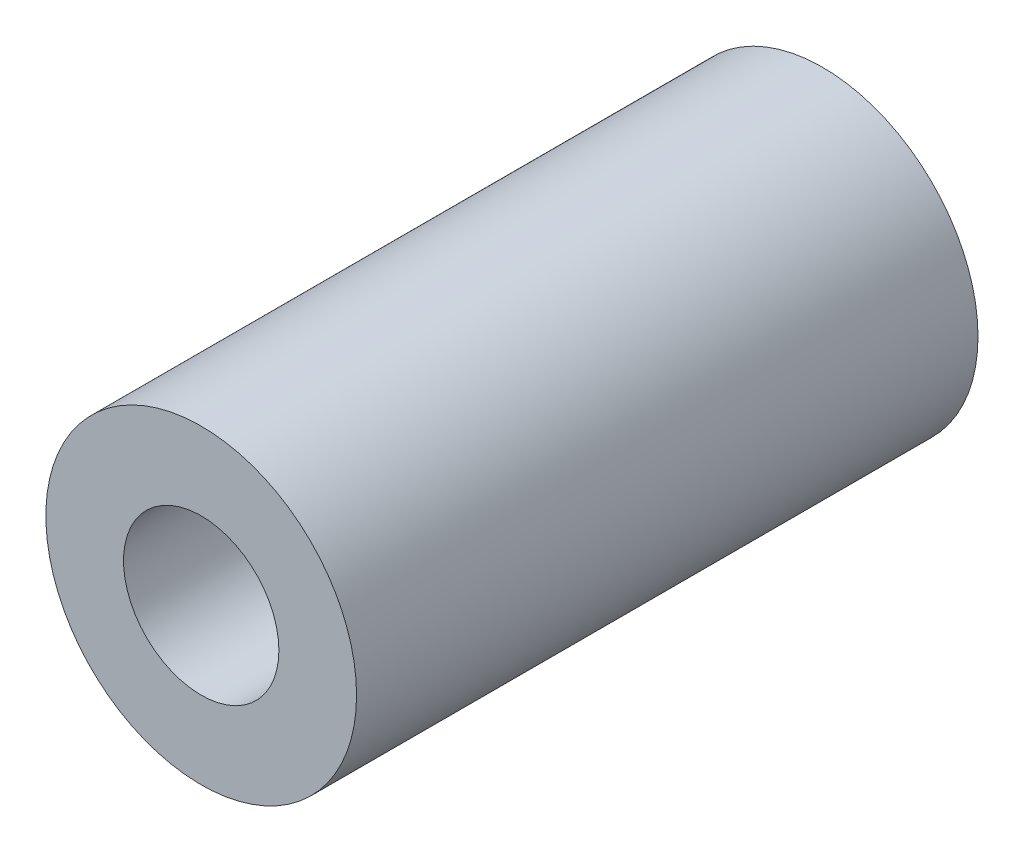
ISO-10303-21;
HEADER;
FILE_DESCRIPTION(('STEP AP214'),'2;1');
FILE_NAME('part.step','',(''),(''),'','','');
FILE_SCHEMA(('AUTOMOTIVE_DESIGN { 1 0 10303 214 1 1 1 1 }'));
ENDSEC;
DATA;
#1=APPLICATION_CONTEXT('core data for automotive mechanical design processes');
#2=APPLICATION_PROTOCOL_DEFINITION('international standard','automotive_design',2000,#1);
#3=PRODUCT_CONTEXT('',#1,'mechanical');
#4=PRODUCT('Part','Part','',(#3));
#5=PRODUCT_RELATED_PRODUCT_CATEGORY('part','',(#4));
#6=PRODUCT_DEFINITION_FORMATION('','',#4);
#7=PRODUCT_DEFINITION_CONTEXT('part definition',#1,'design');
#8=PRODUCT_DEFINITION('design','',#6,#7);
#9=PRODUCT_DEFINITION_SHAPE('','',#8);
#10=(LENGTH_UNIT() NAMED_UNIT(*) SI_UNIT(.MILLI.,.METRE.));
#11=(NAMED_UNIT(*) PLANE_ANGLE_UNIT() SI_UNIT($,.RADIAN.));
#12=(NAMED_UNIT(*) SI_UNIT($,.STERADIAN.) SOLID_ANGLE_UNIT());
#13=UNCERTAINTY_MEASURE_WITH_UNIT(LENGTH_MEASURE(1.E-05),#10,'distance_accuracy_value','');
#14=(GEOMETRIC_REPRESENTATION_CONTEXT(3) GLOBAL_UNCERTAINTY_ASSIGNED_CONTEXT((#13)) GLOBAL_UNIT_ASSIGNED_CONTEXT((#10,
#11,#12)) REPRESENTATION_CONTEXT('',''));
#15=CARTESIAN_POINT('',(0.,0.,0.));
#16=DIRECTION('',(0.,0.,1.));
#17=DIRECTION('',(1.,0.,0.));
#18=AXIS2_PLACEMENT_3D('',#15,#16,#17);
#19=CARTESIAN_POINT('',(4.,4.,16.));
#20=DIRECTION('',(0.,0.,1.));
#21=DIRECTION('',(1.,0.,0.));
#22=AXIS2_PLACEMENT_3D('',#19,#20,#21);
#23=PLANE('',#22);
#24=CARTESIAN_POINT('',(4.,4.,16.));
#25=DIRECTION('',(0.,0.,1.));
#26=DIRECTION('',(1.,0.,0.));
#27=AXIS2_PLACEMENT_3D('',#24,#25,#26);
#28=CIRCLE('',#27,4.);
#29=CARTESIAN_POINT('',(8.,4.,16.));
#30=VERTEX_POINT('',#29);
#31=EDGE_CURVE('E10',#30,#30,#28,.T.);
#32=ORIENTED_EDGE('',*,*,#31,.T.);
#33=EDGE_LOOP('',(#32));
#34=FACE_BOUND('',#33,.T.);
#35=CARTESIAN_POINT('',(4.,4.,16.));
#36=DIRECTION('',(0.,0.,1.));
#37=DIRECTION('',(1.,0.,0.));
#38=AXIS2_PLACEMENT_3D('',#35,#36,#37);
#39=CIRCLE('',#38,2.);
#40=CARTESIAN_POINT('',(6.,4.,16.));
#41=VERTEX_POINT('',#40);
#42=EDGE_CURVE('E55',#41,#41,#39,.T.);
#43=ORIENTED_EDGE('',*,*,#42,.F.);
#44=EDGE_LOOP('',(#43));
#45=FACE_BOUND('',#44,.T.);
#46=ADVANCED_FACE('F41',(#34,#45),#23,.T.);
#47=CARTESIAN_POINT('',(4.,4.,0.));
#48=DIRECTION('',(0.,0.,1.));
#49=DIRECTION('',(1.,0.,0.));
#50=AXIS2_PLACEMENT_3D('',#47,#48,#49);
#51=PLANE('',#50);
#52=CARTESIAN_POINT('',(4.,4.,0.));
#53=DIRECTION('',(0.,0.,1.));
#54=DIRECTION('',(1.,0.,0.));
#55=AXIS2_PLACEMENT_3D('',#52,#53,#54);
#56=CIRCLE('',#55,4.);
#57=CARTESIAN_POINT('',(8.,4.,0.));
#58=VERTEX_POINT('',#57);
#59=EDGE_CURVE('E44',#58,#58,#56,.T.);
#60=ORIENTED_EDGE('',*,*,#59,.F.);
#61=EDGE_LOOP('',(#60));
#62=FACE_BOUND('',#61,.T.);
#63=CARTESIAN_POINT('',(4.,4.,0.));
#64=DIRECTION('',(0.,0.,1.));
#65=DIRECTION('',(1.,0.,0.));
#66=AXIS2_PLACEMENT_3D('',#63,#64,#65);
#67=CIRCLE('',#66,2.);
#68=CARTESIAN_POINT('',(6.,4.,0.));
#69=VERTEX_POINT('',#68);
#70=EDGE_CURVE('E53',#69,#69,#67,.T.);
#71=ORIENTED_EDGE('',*,*,#70,.T.);
#72=EDGE_LOOP('',(#71));
#73=FACE_BOUND('',#72,.T.);
#74=ADVANCED_FACE('F62',(#62,#73),#51,.F.);
#75=CARTESIAN_POINT('',(4.,4.,16.));
#76=DIRECTION('',(0.,0.,-1.));
#77=DIRECTION('',(-1.,0.,0.));
#78=AXIS2_PLACEMENT_3D('',#75,#76,#77);
#79=CYLINDRICAL_SURFACE('',#78,4.);
#80=ORIENTED_EDGE('',*,*,#31,.F.);
#81=EDGE_LOOP('',(#80));
#82=FACE_BOUND('',#81,.T.);
#83=ORIENTED_EDGE('',*,*,#59,.T.);
#84=EDGE_LOOP('',(#83));
#85=FACE_BOUND('',#84,.T.);
#86=ADVANCED_FACE('F43',(#82,#85),#79,.T.);
#87=CARTESIAN_POINT('',(4.,4.,16.));
#88=DIRECTION('',(0.,0.,-1.));
#89=DIRECTION('',(-1.,0.,0.));
#90=AXIS2_PLACEMENT_3D('',#87,#88,#89);
#91=CYLINDRICAL_SURFACE('',#90,2.);
#92=ORIENTED_EDGE('',*,*,#42,.T.);
#93=EDGE_LOOP('',(#92));
#94=FACE_BOUND('',#93,.T.);
#95=ORIENTED_EDGE('',*,*,#70,.F.);
#96=EDGE_LOOP('',(#95));
#97=FACE_BOUND('',#96,.T.);
#98=ADVANCED_FACE('F58',(#94,#97),#91,.F.);
#99=CLOSED_SHELL('',(#46,#74,#86,#98));
#100=MANIFOLD_SOLID_BREP('B2',#99);
#101=ADVANCED_BREP_SHAPE_REPRESENTATION('',(#18,#100),#14);
#102=SHAPE_DEFINITION_REPRESENTATION(#9,#101);
ENDSEC;
END-ISO-10303-21;
